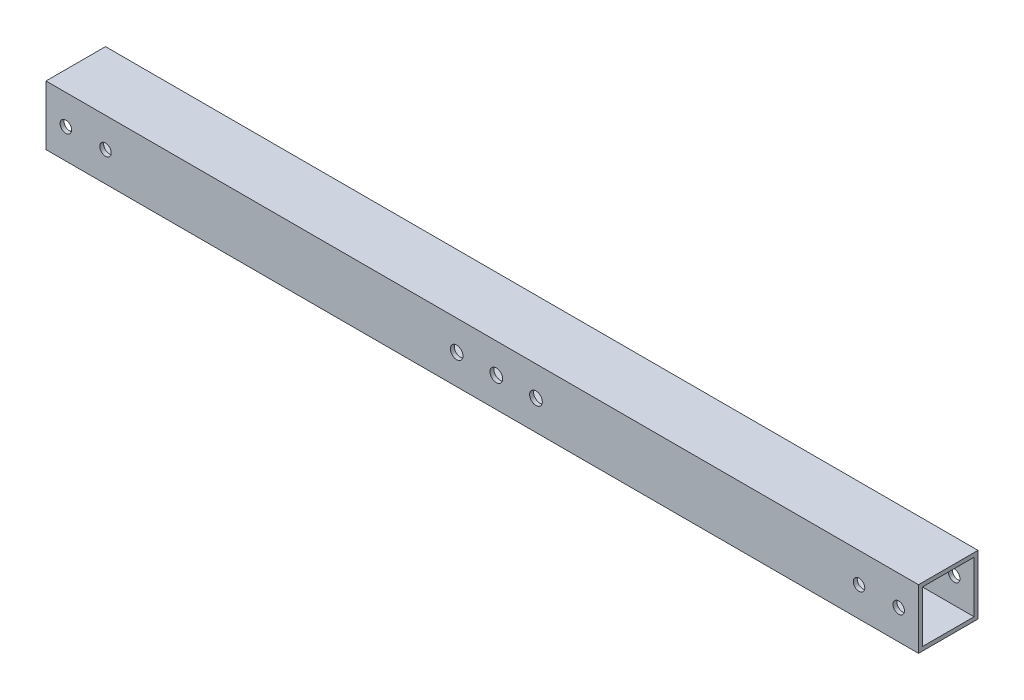
ISO-10303-21;
HEADER;
FILE_DESCRIPTION(('STEP AP214'),'2;1');
FILE_NAME('part.step','',(''),(''),'','','');
FILE_SCHEMA(('AUTOMOTIVE_DESIGN { 1 0 10303 214 1 1 1 1 }'));
ENDSEC;
DATA;
#1=APPLICATION_CONTEXT('core data for automotive mechanical design processes');
#2=APPLICATION_PROTOCOL_DEFINITION('international standard','automotive_design',2000,#1);
#3=PRODUCT_CONTEXT('',#1,'mechanical');
#4=PRODUCT('Part','Part','',(#3));
#5=PRODUCT_RELATED_PRODUCT_CATEGORY('part','',(#4));
#6=PRODUCT_DEFINITION_FORMATION('','',#4);
#7=PRODUCT_DEFINITION_CONTEXT('part definition',#1,'design');
#8=PRODUCT_DEFINITION('design','',#6,#7);
#9=PRODUCT_DEFINITION_SHAPE('','',#8);
#10=(LENGTH_UNIT() NAMED_UNIT(*) SI_UNIT(.MILLI.,.METRE.));
#11=(NAMED_UNIT(*) PLANE_ANGLE_UNIT() SI_UNIT($,.RADIAN.));
#12=(NAMED_UNIT(*) SI_UNIT($,.STERADIAN.) SOLID_ANGLE_UNIT());
#13=UNCERTAINTY_MEASURE_WITH_UNIT(LENGTH_MEASURE(1.E-05),#10,'distance_accuracy_value','');
#14=(GEOMETRIC_REPRESENTATION_CONTEXT(3) GLOBAL_UNCERTAINTY_ASSIGNED_CONTEXT((#13)) GLOBAL_UNIT_ASSIGNED_CONTEXT((#10,
#11,#12)) REPRESENTATION_CONTEXT('',''));
#15=CARTESIAN_POINT('',(0.,0.,0.));
#16=DIRECTION('',(0.,0.,1.));
#17=DIRECTION('',(1.,0.,0.));
#18=AXIS2_PLACEMENT_3D('',#15,#16,#17);
#19=CARTESIAN_POINT('',(220.,0.,0.));
#20=DIRECTION('',(-1.,0.,0.));
#21=DIRECTION('',(0.,0.,1.));
#22=AXIS2_PLACEMENT_3D('',#19,#20,#21);
#23=PLANE('',#22);
#24=DIRECTION('',(0.,1.,0.));
#25=VECTOR('',#24,1.);
#26=CARTESIAN_POINT('',(220.,-7.5,-7.5));
#27=LINE('',#26,#25);
#28=CARTESIAN_POINT('',(220.,-7.5,-7.5));
#29=VERTEX_POINT('',#28);
#30=CARTESIAN_POINT('',(220.,7.5,-7.5));
#31=VERTEX_POINT('',#30);
#32=EDGE_CURVE('E146',#29,#31,#27,.T.);
#33=ORIENTED_EDGE('',*,*,#32,.T.);
#34=DIRECTION('',(0.,0.,1.));
#35=VECTOR('',#34,1.);
#36=CARTESIAN_POINT('',(220.,7.5,7.5));
#37=LINE('',#36,#35);
#38=CARTESIAN_POINT('',(220.,7.5,7.5));
#39=VERTEX_POINT('',#38);
#40=EDGE_CURVE('E149',#31,#39,#37,.T.);
#41=ORIENTED_EDGE('',*,*,#40,.T.);
#42=DIRECTION('',(0.,-1.,0.));
#43=VECTOR('',#42,1.);
#44=CARTESIAN_POINT('',(220.,-7.5,7.5));
#45=LINE('',#44,#43);
#46=CARTESIAN_POINT('',(220.,-7.5,7.5));
#47=VERTEX_POINT('',#46);
#48=EDGE_CURVE('E152',#39,#47,#45,.T.);
#49=ORIENTED_EDGE('',*,*,#48,.T.);
#50=DIRECTION('',(0.,0.,-1.));
#51=VECTOR('',#50,1.);
#52=CARTESIAN_POINT('',(220.,-7.5,7.5));
#53=LINE('',#52,#51);
#54=EDGE_CURVE('E154',#47,#29,#53,.T.);
#55=ORIENTED_EDGE('',*,*,#54,.T.);
#56=EDGE_LOOP('',(#33,#41,#49,#55));
#57=FACE_BOUND('',#56,.T.);
#58=DIRECTION('',(0.,0.,-1.));
#59=VECTOR('',#58,1.);
#60=CARTESIAN_POINT('',(220.,-6.5,6.5));
#61=LINE('',#60,#59);
#62=CARTESIAN_POINT('',(220.,-6.5,6.5));
#63=VERTEX_POINT('',#62);
#64=CARTESIAN_POINT('',(220.,-6.5,-6.5));
#65=VERTEX_POINT('',#64);
#66=EDGE_CURVE('E108',#63,#65,#61,.T.);
#67=ORIENTED_EDGE('',*,*,#66,.F.);
#68=DIRECTION('',(0.,-1.,0.));
#69=VECTOR('',#68,1.);
#70=CARTESIAN_POINT('',(220.,-6.5,6.5));
#71=LINE('',#70,#69);
#72=CARTESIAN_POINT('',(220.,6.5,6.5));
#73=VERTEX_POINT('',#72);
#74=EDGE_CURVE('E130',#73,#63,#71,.T.);
#75=ORIENTED_EDGE('',*,*,#74,.F.);
#76=DIRECTION('',(0.,0.,1.));
#77=VECTOR('',#76,1.);
#78=CARTESIAN_POINT('',(220.,6.5,6.5));
#79=LINE('',#78,#77);
#80=CARTESIAN_POINT('',(220.,6.5,-6.5));
#81=VERTEX_POINT('',#80);
#82=EDGE_CURVE('E128',#81,#73,#79,.T.);
#83=ORIENTED_EDGE('',*,*,#82,.F.);
#84=DIRECTION('',(0.,1.,0.));
#85=VECTOR('',#84,1.);
#86=CARTESIAN_POINT('',(220.,-6.5,-6.5));
#87=LINE('',#86,#85);
#88=EDGE_CURVE('E116',#65,#81,#87,.T.);
#89=ORIENTED_EDGE('',*,*,#88,.F.);
#90=EDGE_LOOP('',(#67,#75,#83,#89));
#91=FACE_BOUND('',#90,.T.);
#92=ADVANCED_FACE('F41',(#57,#91),#23,.F.);
#93=CARTESIAN_POINT('',(0.,0.,0.));
#94=DIRECTION('',(-1.,0.,0.));
#95=DIRECTION('',(0.,0.,1.));
#96=AXIS2_PLACEMENT_3D('',#93,#94,#95);
#97=PLANE('',#96);
#98=DIRECTION('',(0.,1.,0.));
#99=VECTOR('',#98,1.);
#100=CARTESIAN_POINT('',(0.,-7.5,-7.5));
#101=LINE('',#100,#99);
#102=CARTESIAN_POINT('',(0.,-7.5,-7.5));
#103=VERTEX_POINT('',#102);
#104=CARTESIAN_POINT('',(0.,7.5,-7.5));
#105=VERTEX_POINT('',#104);
#106=EDGE_CURVE('E124',#103,#105,#101,.T.);
#107=ORIENTED_EDGE('',*,*,#106,.F.);
#108=DIRECTION('',(0.,0.,-1.));
#109=VECTOR('',#108,1.);
#110=CARTESIAN_POINT('',(0.,-7.5,7.5));
#111=LINE('',#110,#109);
#112=CARTESIAN_POINT('',(0.,-7.5,7.5));
#113=VERTEX_POINT('',#112);
#114=EDGE_CURVE('E150',#113,#103,#111,.T.);
#115=ORIENTED_EDGE('',*,*,#114,.F.);
#116=DIRECTION('',(0.,-1.,0.));
#117=VECTOR('',#116,1.);
#118=CARTESIAN_POINT('',(0.,-7.5,7.5));
#119=LINE('',#118,#117);
#120=CARTESIAN_POINT('',(0.,7.5,7.5));
#121=VERTEX_POINT('',#120);
#122=EDGE_CURVE('E161',#121,#113,#119,.T.);
#123=ORIENTED_EDGE('',*,*,#122,.F.);
#124=DIRECTION('',(0.,0.,1.));
#125=VECTOR('',#124,1.);
#126=CARTESIAN_POINT('',(0.,7.5,7.5));
#127=LINE('',#126,#125);
#128=EDGE_CURVE('E159',#105,#121,#127,.T.);
#129=ORIENTED_EDGE('',*,*,#128,.F.);
#130=EDGE_LOOP('',(#107,#115,#123,#129));
#131=FACE_BOUND('',#130,.T.);
#132=DIRECTION('',(0.,-1.,0.));
#133=VECTOR('',#132,1.);
#134=CARTESIAN_POINT('',(0.,-6.5,6.5));
#135=LINE('',#134,#133);
#136=CARTESIAN_POINT('',(0.,6.5,6.5));
#137=VERTEX_POINT('',#136);
#138=CARTESIAN_POINT('',(0.,-6.5,6.5));
#139=VERTEX_POINT('',#138);
#140=EDGE_CURVE('E117',#137,#139,#135,.T.);
#141=ORIENTED_EDGE('',*,*,#140,.T.);
#142=DIRECTION('',(0.,0.,-1.));
#143=VECTOR('',#142,1.);
#144=CARTESIAN_POINT('',(0.,-6.5,6.5));
#145=LINE('',#144,#143);
#146=CARTESIAN_POINT('',(0.,-6.5,-6.5));
#147=VERTEX_POINT('',#146);
#148=EDGE_CURVE('E66',#139,#147,#145,.T.);
#149=ORIENTED_EDGE('',*,*,#148,.T.);
#150=DIRECTION('',(0.,1.,0.));
#151=VECTOR('',#150,1.);
#152=CARTESIAN_POINT('',(0.,-6.5,-6.5));
#153=LINE('',#152,#151);
#154=CARTESIAN_POINT('',(0.,6.5,-6.5));
#155=VERTEX_POINT('',#154);
#156=EDGE_CURVE('E123',#147,#155,#153,.T.);
#157=ORIENTED_EDGE('',*,*,#156,.T.);
#158=DIRECTION('',(0.,0.,1.));
#159=VECTOR('',#158,1.);
#160=CARTESIAN_POINT('',(0.,6.5,6.5));
#161=LINE('',#160,#159);
#162=EDGE_CURVE('E138',#155,#137,#161,.T.);
#163=ORIENTED_EDGE('',*,*,#162,.T.);
#164=EDGE_LOOP('',(#141,#149,#157,#163));
#165=FACE_BOUND('',#164,.T.);
#166=ADVANCED_FACE('F231',(#131,#165),#97,.T.);
#167=CARTESIAN_POINT('',(220.,-7.5,-7.5));
#168=DIRECTION('',(0.,0.,1.));
#169=DIRECTION('',(1.,0.,0.));
#170=AXIS2_PLACEMENT_3D('',#167,#168,#169);
#171=PLANE('',#170);
#172=CARTESIAN_POINT('',(215.000000000001,-1.76247905159244E-12,-7.5));
#173=DIRECTION('',(0.,0.,1.));
#174=DIRECTION('',(1.,0.,0.));
#175=AXIS2_PLACEMENT_3D('',#172,#173,#174);
#176=CIRCLE('',#175,1.45000000000003);
#177=CARTESIAN_POINT('',(216.450000000001,-1.76247905159244E-12,-7.5));
#178=VERTEX_POINT('',#177);
#179=EDGE_CURVE('E175',#178,#178,#176,.T.);
#180=ORIENTED_EDGE('',*,*,#179,.T.);
#181=EDGE_LOOP('',(#180));
#182=FACE_BOUND('',#181,.T.);
#183=CARTESIAN_POINT('',(205.000000000001,-1.69309011255336E-12,-7.5));
#184=DIRECTION('',(0.,0.,1.));
#185=DIRECTION('',(1.,0.,0.));
#186=AXIS2_PLACEMENT_3D('',#183,#184,#185);
#187=CIRCLE('',#186,1.45);
#188=CARTESIAN_POINT('',(206.450000000001,-1.69309011255336E-12,-7.5));
#189=VERTEX_POINT('',#188);
#190=EDGE_CURVE('E285',#189,#189,#187,.T.);
#191=ORIENTED_EDGE('',*,*,#190,.T.);
#192=EDGE_LOOP('',(#191));
#193=FACE_BOUND('',#192,.T.);
#194=CARTESIAN_POINT('',(123.54518821599,-5.34294830600857E-12,-7.5));
#195=DIRECTION('',(0.,0.,1.));
#196=DIRECTION('',(1.,0.,0.));
#197=AXIS2_PLACEMENT_3D('',#194,#195,#196);
#198=CIRCLE('',#197,1.59999999999999);
#199=CARTESIAN_POINT('',(125.14518821599,-5.34294830600857E-12,-7.5));
#200=VERTEX_POINT('',#199);
#201=EDGE_CURVE('E289',#200,#200,#198,.T.);
#202=ORIENTED_EDGE('',*,*,#201,.T.);
#203=EDGE_LOOP('',(#202));
#204=FACE_BOUND('',#203,.T.);
#205=CARTESIAN_POINT('',(113.54518821599,-5.52335954751015E-12,-7.5));
#206=DIRECTION('',(0.,0.,1.));
#207=DIRECTION('',(1.,0.,0.));
#208=AXIS2_PLACEMENT_3D('',#205,#206,#207);
#209=CIRCLE('',#208,1.59999999999999);
#210=CARTESIAN_POINT('',(115.14518821599,-5.52335954751015E-12,-7.5));
#211=VERTEX_POINT('',#210);
#212=EDGE_CURVE('E293',#211,#211,#209,.T.);
#213=ORIENTED_EDGE('',*,*,#212,.T.);
#214=EDGE_LOOP('',(#213));
#215=FACE_BOUND('',#214,.T.);
#216=CARTESIAN_POINT('',(103.54518821599,-5.71764857681956E-12,-7.5));
#217=DIRECTION('',(0.,0.,1.));
#218=DIRECTION('',(1.,0.,0.));
#219=AXIS2_PLACEMENT_3D('',#216,#217,#218);
#220=CIRCLE('',#219,1.60000000000001);
#221=CARTESIAN_POINT('',(105.14518821599,-5.71764857681956E-12,-7.5));
#222=VERTEX_POINT('',#221);
#223=EDGE_CURVE('E297',#222,#222,#220,.T.);
#224=ORIENTED_EDGE('',*,*,#223,.T.);
#225=EDGE_LOOP('',(#224));
#226=FACE_BOUND('',#225,.T.);
#227=CARTESIAN_POINT('',(14.9999999999956,9.0205620750794E-13,-7.5));
#228=DIRECTION('',(0.,0.,1.));
#229=DIRECTION('',(1.,0.,0.));
#230=AXIS2_PLACEMENT_3D('',#227,#228,#229);
#231=CIRCLE('',#230,1.45);
#232=CARTESIAN_POINT('',(16.4499999999956,9.0205620750794E-13,-7.5));
#233=VERTEX_POINT('',#232);
#234=EDGE_CURVE('E301',#233,#233,#231,.T.);
#235=ORIENTED_EDGE('',*,*,#234,.T.);
#236=EDGE_LOOP('',(#235));
#237=FACE_BOUND('',#236,.T.);
#238=CARTESIAN_POINT('',(4.99999999999559,1.08246744900953E-12,-7.5));
#239=DIRECTION('',(0.,0.,1.));
#240=DIRECTION('',(1.,0.,0.));
#241=AXIS2_PLACEMENT_3D('',#238,#239,#240);
#242=CIRCLE('',#241,1.45);
#243=CARTESIAN_POINT('',(6.44999999999559,1.08246744900953E-12,-7.5));
#244=VERTEX_POINT('',#243);
#245=EDGE_CURVE('E304',#244,#244,#242,.T.);
#246=ORIENTED_EDGE('',*,*,#245,.T.);
#247=EDGE_LOOP('',(#246));
#248=FACE_BOUND('',#247,.T.);
#249=ORIENTED_EDGE('',*,*,#106,.T.);
#250=DIRECTION('',(-1.,0.,0.));
#251=VECTOR('',#250,1.);
#252=CARTESIAN_POINT('',(220.,7.5,-7.5));
#253=LINE('',#252,#251);
#254=EDGE_CURVE('E11',#31,#105,#253,.T.);
#255=ORIENTED_EDGE('',*,*,#254,.F.);
#256=ORIENTED_EDGE('',*,*,#32,.F.);
#257=DIRECTION('',(-1.,0.,0.));
#258=VECTOR('',#257,1.);
#259=CARTESIAN_POINT('',(220.,-7.5,-7.5));
#260=LINE('',#259,#258);
#261=EDGE_CURVE('E156',#29,#103,#260,.T.);
#262=ORIENTED_EDGE('',*,*,#261,.T.);
#263=EDGE_LOOP('',(#249,#255,#256,#262));
#264=FACE_BOUND('',#263,.T.);
#265=ADVANCED_FACE('F43',(#182,#193,#204,#215,#226,#237,#248,#264),#171,.F.);
#266=CARTESIAN_POINT('',(220.,7.5,7.5));
#267=DIRECTION('',(0.,-1.,0.));
#268=DIRECTION('',(0.,0.,-1.));
#269=AXIS2_PLACEMENT_3D('',#266,#267,#268);
#270=PLANE('',#269);
#271=ORIENTED_EDGE('',*,*,#128,.T.);
#272=DIRECTION('',(-1.,0.,0.));
#273=VECTOR('',#272,1.);
#274=CARTESIAN_POINT('',(220.,7.5,7.5));
#275=LINE('',#274,#273);
#276=EDGE_CURVE('E50',#39,#121,#275,.T.);
#277=ORIENTED_EDGE('',*,*,#276,.F.);
#278=ORIENTED_EDGE('',*,*,#40,.F.);
#279=ORIENTED_EDGE('',*,*,#254,.T.);
#280=EDGE_LOOP('',(#271,#277,#278,#279));
#281=FACE_BOUND('',#280,.T.);
#282=ADVANCED_FACE('F258',(#281),#270,.F.);
#283=CARTESIAN_POINT('',(220.,-7.5,7.5));
#284=DIRECTION('',(0.,0.,-1.));
#285=DIRECTION('',(-1.,0.,0.));
#286=AXIS2_PLACEMENT_3D('',#283,#284,#285);
#287=PLANE('',#286);
#288=CARTESIAN_POINT('',(215.000000000001,-1.76247905159244E-12,7.5));
#289=DIRECTION('',(0.,0.,1.));
#290=DIRECTION('',(1.,0.,0.));
#291=AXIS2_PLACEMENT_3D('',#288,#289,#290);
#292=CIRCLE('',#291,1.45000000000003);
#293=CARTESIAN_POINT('',(216.450000000001,-1.76247905159244E-12,7.5));
#294=VERTEX_POINT('',#293);
#295=EDGE_CURVE('E384',#294,#294,#292,.T.);
#296=ORIENTED_EDGE('',*,*,#295,.F.);
#297=EDGE_LOOP('',(#296));
#298=FACE_BOUND('',#297,.T.);
#299=CARTESIAN_POINT('',(205.000000000001,-1.69309011255336E-12,7.5));
#300=DIRECTION('',(0.,0.,1.));
#301=DIRECTION('',(1.,0.,0.));
#302=AXIS2_PLACEMENT_3D('',#299,#300,#301);
#303=CIRCLE('',#302,1.45);
#304=CARTESIAN_POINT('',(206.450000000001,-1.69309011255336E-12,7.5));
#305=VERTEX_POINT('',#304);
#306=EDGE_CURVE('E380',#305,#305,#303,.T.);
#307=ORIENTED_EDGE('',*,*,#306,.F.);
#308=EDGE_LOOP('',(#307));
#309=FACE_BOUND('',#308,.T.);
#310=CARTESIAN_POINT('',(123.54518821599,-5.34294830600857E-12,7.5));
#311=DIRECTION('',(0.,0.,1.));
#312=DIRECTION('',(1.,0.,0.));
#313=AXIS2_PLACEMENT_3D('',#310,#311,#312);
#314=CIRCLE('',#313,1.59999999999999);
#315=CARTESIAN_POINT('',(125.14518821599,-5.34294830600857E-12,7.5));
#316=VERTEX_POINT('',#315);
#317=EDGE_CURVE('E381',#316,#316,#314,.T.);
#318=ORIENTED_EDGE('',*,*,#317,.F.);
#319=EDGE_LOOP('',(#318));
#320=FACE_BOUND('',#319,.T.);
#321=CARTESIAN_POINT('',(113.54518821599,-5.52335954751015E-12,7.5));
#322=DIRECTION('',(0.,0.,1.));
#323=DIRECTION('',(1.,0.,0.));
#324=AXIS2_PLACEMENT_3D('',#321,#322,#323);
#325=CIRCLE('',#324,1.59999999999999);
#326=CARTESIAN_POINT('',(115.14518821599,-5.52335954751015E-12,7.5));
#327=VERTEX_POINT('',#326);
#328=EDGE_CURVE('E391',#327,#327,#325,.T.);
#329=ORIENTED_EDGE('',*,*,#328,.F.);
#330=EDGE_LOOP('',(#329));
#331=FACE_BOUND('',#330,.T.);
#332=CARTESIAN_POINT('',(103.54518821599,-5.71764857681956E-12,7.5));
#333=DIRECTION('',(0.,0.,1.));
#334=DIRECTION('',(1.,0.,0.));
#335=AXIS2_PLACEMENT_3D('',#332,#333,#334);
#336=CIRCLE('',#335,1.60000000000001);
#337=CARTESIAN_POINT('',(105.14518821599,-5.71764857681956E-12,7.5));
#338=VERTEX_POINT('',#337);
#339=EDGE_CURVE('E395',#338,#338,#336,.T.);
#340=ORIENTED_EDGE('',*,*,#339,.F.);
#341=EDGE_LOOP('',(#340));
#342=FACE_BOUND('',#341,.T.);
#343=CARTESIAN_POINT('',(14.9999999999956,9.0205620750794E-13,7.5));
#344=DIRECTION('',(0.,0.,1.));
#345=DIRECTION('',(1.,0.,0.));
#346=AXIS2_PLACEMENT_3D('',#343,#344,#345);
#347=CIRCLE('',#346,1.45);
#348=CARTESIAN_POINT('',(16.4499999999956,9.0205620750794E-13,7.5));
#349=VERTEX_POINT('',#348);
#350=EDGE_CURVE('E399',#349,#349,#347,.T.);
#351=ORIENTED_EDGE('',*,*,#350,.F.);
#352=EDGE_LOOP('',(#351));
#353=FACE_BOUND('',#352,.T.);
#354=CARTESIAN_POINT('',(4.99999999999559,1.08246744900953E-12,7.5));
#355=DIRECTION('',(0.,0.,1.));
#356=DIRECTION('',(1.,0.,0.));
#357=AXIS2_PLACEMENT_3D('',#354,#355,#356);
#358=CIRCLE('',#357,1.45);
#359=CARTESIAN_POINT('',(6.44999999999559,1.08246744900953E-12,7.5));
#360=VERTEX_POINT('',#359);
#361=EDGE_CURVE('E306',#360,#360,#358,.T.);
#362=ORIENTED_EDGE('',*,*,#361,.F.);
#363=EDGE_LOOP('',(#362));
#364=FACE_BOUND('',#363,.T.);
#365=ORIENTED_EDGE('',*,*,#122,.T.);
#366=DIRECTION('',(-1.,0.,0.));
#367=VECTOR('',#366,1.);
#368=CARTESIAN_POINT('',(220.,-7.5,7.5));
#369=LINE('',#368,#367);
#370=EDGE_CURVE('E166',#47,#113,#369,.T.);
#371=ORIENTED_EDGE('',*,*,#370,.F.);
#372=ORIENTED_EDGE('',*,*,#48,.F.);
#373=ORIENTED_EDGE('',*,*,#276,.T.);
#374=EDGE_LOOP('',(#365,#371,#372,#373));
#375=FACE_BOUND('',#374,.T.);
#376=ADVANCED_FACE('F255',(#298,#309,#320,#331,#342,#353,#364,#375),#287,.F.);
#377=CARTESIAN_POINT('',(220.,-7.5,7.5));
#378=DIRECTION('',(0.,1.,0.));
#379=DIRECTION('',(0.,0.,1.));
#380=AXIS2_PLACEMENT_3D('',#377,#378,#379);
#381=PLANE('',#380);
#382=ORIENTED_EDGE('',*,*,#114,.T.);
#383=ORIENTED_EDGE('',*,*,#261,.F.);
#384=ORIENTED_EDGE('',*,*,#54,.F.);
#385=ORIENTED_EDGE('',*,*,#370,.T.);
#386=EDGE_LOOP('',(#382,#383,#384,#385));
#387=FACE_BOUND('',#386,.T.);
#388=ADVANCED_FACE('F252',(#387),#381,.F.);
#389=CARTESIAN_POINT('',(220.,-6.5,6.5));
#390=DIRECTION('',(0.,1.,0.));
#391=DIRECTION('',(0.,0.,1.));
#392=AXIS2_PLACEMENT_3D('',#389,#390,#391);
#393=PLANE('',#392);
#394=ORIENTED_EDGE('',*,*,#148,.F.);
#395=DIRECTION('',(-1.,0.,0.));
#396=VECTOR('',#395,1.);
#397=CARTESIAN_POINT('',(220.,-6.5,6.5));
#398=LINE('',#397,#396);
#399=EDGE_CURVE('E112',#63,#139,#398,.T.);
#400=ORIENTED_EDGE('',*,*,#399,.F.);
#401=ORIENTED_EDGE('',*,*,#66,.T.);
#402=DIRECTION('',(-1.,0.,0.));
#403=VECTOR('',#402,1.);
#404=CARTESIAN_POINT('',(220.,-6.5,-6.5));
#405=LINE('',#404,#403);
#406=EDGE_CURVE('E111',#65,#147,#405,.T.);
#407=ORIENTED_EDGE('',*,*,#406,.T.);
#408=EDGE_LOOP('',(#394,#400,#401,#407));
#409=FACE_BOUND('',#408,.T.);
#410=ADVANCED_FACE('F110',(#409),#393,.T.);
#411=CARTESIAN_POINT('',(220.,-6.5,-6.5));
#412=DIRECTION('',(0.,0.,1.));
#413=DIRECTION('',(0.,-1.,0.));
#414=AXIS2_PLACEMENT_3D('',#411,#412,#413);
#415=PLANE('',#414);
#416=CARTESIAN_POINT('',(215.000000000001,-1.76247905159244E-12,-6.5));
#417=DIRECTION('',(0.,0.,1.));
#418=DIRECTION('',(0.,-1.,0.));
#419=AXIS2_PLACEMENT_3D('',#416,#417,#418);
#420=CIRCLE('',#419,1.45000000000003);
#421=CARTESIAN_POINT('',(215.000000000001,-1.45000000000179,-6.5));
#422=VERTEX_POINT('',#421);
#423=EDGE_CURVE('E136',#422,#422,#420,.T.);
#424=ORIENTED_EDGE('',*,*,#423,.F.);
#425=EDGE_LOOP('',(#424));
#426=FACE_BOUND('',#425,.T.);
#427=CARTESIAN_POINT('',(205.000000000001,-1.69309011255336E-12,-6.5));
#428=DIRECTION('',(0.,0.,1.));
#429=DIRECTION('',(0.,-1.,0.));
#430=AXIS2_PLACEMENT_3D('',#427,#428,#429);
#431=CIRCLE('',#430,1.45);
#432=CARTESIAN_POINT('',(205.000000000001,-1.45000000000169,-6.5));
#433=VERTEX_POINT('',#432);
#434=EDGE_CURVE('E193',#433,#433,#431,.T.);
#435=ORIENTED_EDGE('',*,*,#434,.F.);
#436=EDGE_LOOP('',(#435));
#437=FACE_BOUND('',#436,.T.);
#438=CARTESIAN_POINT('',(123.54518821599,-5.34294830600857E-12,-6.5));
#439=DIRECTION('',(0.,0.,1.));
#440=DIRECTION('',(0.,-1.,0.));
#441=AXIS2_PLACEMENT_3D('',#438,#439,#440);
#442=CIRCLE('',#441,1.59999999999999);
#443=CARTESIAN_POINT('',(123.54518821599,-1.60000000000533,-6.5));
#444=VERTEX_POINT('',#443);
#445=EDGE_CURVE('E190',#444,#444,#442,.T.);
#446=ORIENTED_EDGE('',*,*,#445,.F.);
#447=EDGE_LOOP('',(#446));
#448=FACE_BOUND('',#447,.T.);
#449=CARTESIAN_POINT('',(113.54518821599,-5.52335954751015E-12,-6.5));
#450=DIRECTION('',(0.,0.,1.));
#451=DIRECTION('',(0.,-1.,0.));
#452=AXIS2_PLACEMENT_3D('',#449,#450,#451);
#453=CIRCLE('',#452,1.59999999999999);
#454=CARTESIAN_POINT('',(113.54518821599,-1.60000000000551,-6.5));
#455=VERTEX_POINT('',#454);
#456=EDGE_CURVE('E187',#455,#455,#453,.T.);
#457=ORIENTED_EDGE('',*,*,#456,.F.);
#458=EDGE_LOOP('',(#457));
#459=FACE_BOUND('',#458,.T.);
#460=CARTESIAN_POINT('',(103.54518821599,-5.71764857681956E-12,-6.5));
#461=DIRECTION('',(0.,0.,1.));
#462=DIRECTION('',(0.,-1.,0.));
#463=AXIS2_PLACEMENT_3D('',#460,#461,#462);
#464=CIRCLE('',#463,1.60000000000001);
#465=CARTESIAN_POINT('',(103.54518821599,-1.60000000000572,-6.5));
#466=VERTEX_POINT('',#465);
#467=EDGE_CURVE('E183',#466,#466,#464,.T.);
#468=ORIENTED_EDGE('',*,*,#467,.F.);
#469=EDGE_LOOP('',(#468));
#470=FACE_BOUND('',#469,.T.);
#471=CARTESIAN_POINT('',(14.9999999999956,9.0205620750794E-13,-6.5));
#472=DIRECTION('',(0.,0.,1.));
#473=DIRECTION('',(0.,-1.,0.));
#474=AXIS2_PLACEMENT_3D('',#471,#472,#473);
#475=CIRCLE('',#474,1.45);
#476=CARTESIAN_POINT('',(14.9999999999956,-1.4499999999991,-6.5));
#477=VERTEX_POINT('',#476);
#478=EDGE_CURVE('E179',#477,#477,#475,.T.);
#479=ORIENTED_EDGE('',*,*,#478,.F.);
#480=EDGE_LOOP('',(#479));
#481=FACE_BOUND('',#480,.T.);
#482=CARTESIAN_POINT('',(4.99999999999559,1.08246744900953E-12,-6.5));
#483=DIRECTION('',(0.,0.,1.));
#484=DIRECTION('',(0.,-1.,0.));
#485=AXIS2_PLACEMENT_3D('',#482,#483,#484);
#486=CIRCLE('',#485,1.45);
#487=CARTESIAN_POINT('',(4.99999999999559,-1.44999999999892,-6.5));
#488=VERTEX_POINT('',#487);
#489=EDGE_CURVE('E174',#488,#488,#486,.T.);
#490=ORIENTED_EDGE('',*,*,#489,.F.);
#491=EDGE_LOOP('',(#490));
#492=FACE_BOUND('',#491,.T.);
#493=ORIENTED_EDGE('',*,*,#156,.F.);
#494=ORIENTED_EDGE('',*,*,#406,.F.);
#495=ORIENTED_EDGE('',*,*,#88,.T.);
#496=DIRECTION('',(-1.,0.,0.));
#497=VECTOR('',#496,1.);
#498=CARTESIAN_POINT('',(220.,6.5,-6.5));
#499=LINE('',#498,#497);
#500=EDGE_CURVE('E125',#81,#155,#499,.T.);
#501=ORIENTED_EDGE('',*,*,#500,.T.);
#502=EDGE_LOOP('',(#493,#494,#495,#501));
#503=FACE_BOUND('',#502,.T.);
#504=ADVANCED_FACE('F120',(#426,#437,#448,#459,#470,#481,#492,#503),#415,.T.);
#505=CARTESIAN_POINT('',(220.,6.5,6.5));
#506=DIRECTION('',(0.,-1.,0.));
#507=DIRECTION('',(0.,0.,-1.));
#508=AXIS2_PLACEMENT_3D('',#505,#506,#507);
#509=PLANE('',#508);
#510=ORIENTED_EDGE('',*,*,#162,.F.);
#511=ORIENTED_EDGE('',*,*,#500,.F.);
#512=ORIENTED_EDGE('',*,*,#82,.T.);
#513=DIRECTION('',(-1.,0.,0.));
#514=VECTOR('',#513,1.);
#515=CARTESIAN_POINT('',(220.,6.5,6.5));
#516=LINE('',#515,#514);
#517=EDGE_CURVE('E58',#73,#137,#516,.T.);
#518=ORIENTED_EDGE('',*,*,#517,.T.);
#519=EDGE_LOOP('',(#510,#511,#512,#518));
#520=FACE_BOUND('',#519,.T.);
#521=ADVANCED_FACE('F217',(#520),#509,.T.);
#522=CARTESIAN_POINT('',(220.,-6.5,6.5));
#523=DIRECTION('',(0.,0.,-1.));
#524=DIRECTION('',(-1.,0.,0.));
#525=AXIS2_PLACEMENT_3D('',#522,#523,#524);
#526=PLANE('',#525);
#527=CARTESIAN_POINT('',(215.000000000001,-1.76247905159244E-12,6.5));
#528=DIRECTION('',(0.,0.,-1.));
#529=DIRECTION('',(-1.,0.,0.));
#530=AXIS2_PLACEMENT_3D('',#527,#528,#529);
#531=CIRCLE('',#530,1.45000000000003);
#532=CARTESIAN_POINT('',(213.550000000001,-1.76247905159244E-12,6.5));
#533=VERTEX_POINT('',#532);
#534=EDGE_CURVE('E45',#533,#533,#531,.T.);
#535=ORIENTED_EDGE('',*,*,#534,.F.);
#536=EDGE_LOOP('',(#535));
#537=FACE_BOUND('',#536,.T.);
#538=CARTESIAN_POINT('',(205.000000000001,-1.69309011255336E-12,6.5));
#539=DIRECTION('',(0.,0.,-1.));
#540=DIRECTION('',(-1.,0.,0.));
#541=AXIS2_PLACEMENT_3D('',#538,#539,#540);
#542=CIRCLE('',#541,1.45);
#543=CARTESIAN_POINT('',(203.550000000001,-1.69309011255336E-12,6.5));
#544=VERTEX_POINT('',#543);
#545=EDGE_CURVE('E191',#544,#544,#542,.T.);
#546=ORIENTED_EDGE('',*,*,#545,.F.);
#547=EDGE_LOOP('',(#546));
#548=FACE_BOUND('',#547,.T.);
#549=CARTESIAN_POINT('',(123.54518821599,-5.34294830600857E-12,6.5));
#550=DIRECTION('',(0.,0.,-1.));
#551=DIRECTION('',(-1.,0.,0.));
#552=AXIS2_PLACEMENT_3D('',#549,#550,#551);
#553=CIRCLE('',#552,1.59999999999999);
#554=CARTESIAN_POINT('',(121.94518821599,-5.34294830600857E-12,6.5));
#555=VERTEX_POINT('',#554);
#556=EDGE_CURVE('E188',#555,#555,#553,.T.);
#557=ORIENTED_EDGE('',*,*,#556,.F.);
#558=EDGE_LOOP('',(#557));
#559=FACE_BOUND('',#558,.T.);
#560=CARTESIAN_POINT('',(113.54518821599,-5.52335954751015E-12,6.5));
#561=DIRECTION('',(0.,0.,-1.));
#562=DIRECTION('',(-1.,0.,0.));
#563=AXIS2_PLACEMENT_3D('',#560,#561,#562);
#564=CIRCLE('',#563,1.59999999999999);
#565=CARTESIAN_POINT('',(111.94518821599,-5.52335954751015E-12,6.5));
#566=VERTEX_POINT('',#565);
#567=EDGE_CURVE('E184',#566,#566,#564,.T.);
#568=ORIENTED_EDGE('',*,*,#567,.F.);
#569=EDGE_LOOP('',(#568));
#570=FACE_BOUND('',#569,.T.);
#571=CARTESIAN_POINT('',(103.54518821599,-5.71764857681956E-12,6.5));
#572=DIRECTION('',(0.,0.,-1.));
#573=DIRECTION('',(-1.,0.,0.));
#574=AXIS2_PLACEMENT_3D('',#571,#572,#573);
#575=CIRCLE('',#574,1.60000000000001);
#576=CARTESIAN_POINT('',(101.94518821599,-5.71764857681956E-12,6.5));
#577=VERTEX_POINT('',#576);
#578=EDGE_CURVE('E180',#577,#577,#575,.T.);
#579=ORIENTED_EDGE('',*,*,#578,.F.);
#580=EDGE_LOOP('',(#579));
#581=FACE_BOUND('',#580,.T.);
#582=CARTESIAN_POINT('',(14.9999999999956,9.0205620750794E-13,6.5));
#583=DIRECTION('',(0.,0.,-1.));
#584=DIRECTION('',(-1.,0.,0.));
#585=AXIS2_PLACEMENT_3D('',#582,#583,#584);
#586=CIRCLE('',#585,1.45);
#587=CARTESIAN_POINT('',(13.5499999999956,9.0205620750794E-13,6.5));
#588=VERTEX_POINT('',#587);
#589=EDGE_CURVE('E176',#588,#588,#586,.T.);
#590=ORIENTED_EDGE('',*,*,#589,.F.);
#591=EDGE_LOOP('',(#590));
#592=FACE_BOUND('',#591,.T.);
#593=CARTESIAN_POINT('',(4.99999999999559,1.08246744900953E-12,6.5));
#594=DIRECTION('',(0.,0.,-1.));
#595=DIRECTION('',(-1.,0.,0.));
#596=AXIS2_PLACEMENT_3D('',#593,#594,#595);
#597=CIRCLE('',#596,1.45);
#598=CARTESIAN_POINT('',(3.54999999999559,1.08246744900953E-12,6.5));
#599=VERTEX_POINT('',#598);
#600=EDGE_CURVE('E171',#599,#599,#597,.T.);
#601=ORIENTED_EDGE('',*,*,#600,.F.);
#602=EDGE_LOOP('',(#601));
#603=FACE_BOUND('',#602,.T.);
#604=ORIENTED_EDGE('',*,*,#140,.F.);
#605=ORIENTED_EDGE('',*,*,#517,.F.);
#606=ORIENTED_EDGE('',*,*,#74,.T.);
#607=ORIENTED_EDGE('',*,*,#399,.T.);
#608=EDGE_LOOP('',(#604,#605,#606,#607));
#609=FACE_BOUND('',#608,.T.);
#610=ADVANCED_FACE('F213',(#537,#548,#559,#570,#581,#592,#603,#609),#526,.T.);
#611=CARTESIAN_POINT('',(4.99999999999559,1.08246744900953E-12,-7.5));
#612=DIRECTION('',(0.,0.,1.));
#613=DIRECTION('',(1.,0.,0.));
#614=AXIS2_PLACEMENT_3D('',#611,#612,#613);
#615=CYLINDRICAL_SURFACE('',#614,1.45);
#616=ORIENTED_EDGE('',*,*,#600,.T.);
#617=EDGE_LOOP('',(#616));
#618=FACE_BOUND('',#617,.T.);
#619=ORIENTED_EDGE('',*,*,#361,.T.);
#620=EDGE_LOOP('',(#619));
#621=FACE_BOUND('',#620,.T.);
#622=ADVANCED_FACE('F216',(#618,#621),#615,.F.);
#623=CARTESIAN_POINT('',(14.9999999999956,9.0205620750794E-13,-7.5));
#624=DIRECTION('',(0.,0.,1.));
#625=DIRECTION('',(1.,0.,0.));
#626=AXIS2_PLACEMENT_3D('',#623,#624,#625);
#627=CYLINDRICAL_SURFACE('',#626,1.45);
#628=ORIENTED_EDGE('',*,*,#589,.T.);
#629=EDGE_LOOP('',(#628));
#630=FACE_BOUND('',#629,.T.);
#631=ORIENTED_EDGE('',*,*,#350,.T.);
#632=EDGE_LOOP('',(#631));
#633=FACE_BOUND('',#632,.T.);
#634=ADVANCED_FACE('F336',(#630,#633),#627,.F.);
#635=CARTESIAN_POINT('',(103.54518821599,-5.71764857681956E-12,-7.5));
#636=DIRECTION('',(0.,0.,1.));
#637=DIRECTION('',(1.,0.,0.));
#638=AXIS2_PLACEMENT_3D('',#635,#636,#637);
#639=CYLINDRICAL_SURFACE('',#638,1.60000000000001);
#640=ORIENTED_EDGE('',*,*,#578,.T.);
#641=EDGE_LOOP('',(#640));
#642=FACE_BOUND('',#641,.T.);
#643=ORIENTED_EDGE('',*,*,#339,.T.);
#644=EDGE_LOOP('',(#643));
#645=FACE_BOUND('',#644,.T.);
#646=ADVANCED_FACE('F345',(#642,#645),#639,.F.);
#647=CARTESIAN_POINT('',(113.54518821599,-5.52335954751015E-12,-7.5));
#648=DIRECTION('',(0.,0.,1.));
#649=DIRECTION('',(1.,0.,0.));
#650=AXIS2_PLACEMENT_3D('',#647,#648,#649);
#651=CYLINDRICAL_SURFACE('',#650,1.59999999999999);
#652=ORIENTED_EDGE('',*,*,#567,.T.);
#653=EDGE_LOOP('',(#652));
#654=FACE_BOUND('',#653,.T.);
#655=ORIENTED_EDGE('',*,*,#328,.T.);
#656=EDGE_LOOP('',(#655));
#657=FACE_BOUND('',#656,.T.);
#658=ADVANCED_FACE('F353',(#654,#657),#651,.F.);
#659=CARTESIAN_POINT('',(123.54518821599,-5.34294830600857E-12,-7.5));
#660=DIRECTION('',(0.,0.,1.));
#661=DIRECTION('',(1.,0.,0.));
#662=AXIS2_PLACEMENT_3D('',#659,#660,#661);
#663=CYLINDRICAL_SURFACE('',#662,1.59999999999999);
#664=ORIENTED_EDGE('',*,*,#556,.T.);
#665=EDGE_LOOP('',(#664));
#666=FACE_BOUND('',#665,.T.);
#667=ORIENTED_EDGE('',*,*,#317,.T.);
#668=EDGE_LOOP('',(#667));
#669=FACE_BOUND('',#668,.T.);
#670=ADVANCED_FACE('F360',(#666,#669),#663,.F.);
#671=CARTESIAN_POINT('',(205.000000000001,-1.69309011255336E-12,-7.5));
#672=DIRECTION('',(0.,0.,1.));
#673=DIRECTION('',(1.,0.,0.));
#674=AXIS2_PLACEMENT_3D('',#671,#672,#673);
#675=CYLINDRICAL_SURFACE('',#674,1.45);
#676=ORIENTED_EDGE('',*,*,#545,.T.);
#677=EDGE_LOOP('',(#676));
#678=FACE_BOUND('',#677,.T.);
#679=ORIENTED_EDGE('',*,*,#306,.T.);
#680=EDGE_LOOP('',(#679));
#681=FACE_BOUND('',#680,.T.);
#682=ADVANCED_FACE('F337',(#678,#681),#675,.F.);
#683=CARTESIAN_POINT('',(215.000000000001,-1.76247905159244E-12,-7.5));
#684=DIRECTION('',(0.,0.,1.));
#685=DIRECTION('',(1.,0.,0.));
#686=AXIS2_PLACEMENT_3D('',#683,#684,#685);
#687=CYLINDRICAL_SURFACE('',#686,1.45000000000003);
#688=ORIENTED_EDGE('',*,*,#534,.T.);
#689=EDGE_LOOP('',(#688));
#690=FACE_BOUND('',#689,.T.);
#691=ORIENTED_EDGE('',*,*,#295,.T.);
#692=EDGE_LOOP('',(#691));
#693=FACE_BOUND('',#692,.T.);
#694=ADVANCED_FACE('F210',(#690,#693),#687,.F.);
#695=ORIENTED_EDGE('',*,*,#489,.T.);
#696=EDGE_LOOP('',(#695));
#697=FACE_BOUND('',#696,.T.);
#698=ORIENTED_EDGE('',*,*,#245,.F.);
#699=EDGE_LOOP('',(#698));
#700=FACE_BOUND('',#699,.T.);
#701=ADVANCED_FACE('F326',(#697,#700),#615,.F.);
#702=ORIENTED_EDGE('',*,*,#478,.T.);
#703=EDGE_LOOP('',(#702));
#704=FACE_BOUND('',#703,.T.);
#705=ORIENTED_EDGE('',*,*,#234,.F.);
#706=EDGE_LOOP('',(#705));
#707=FACE_BOUND('',#706,.T.);
#708=ADVANCED_FACE('F328',(#704,#707),#627,.F.);
#709=ORIENTED_EDGE('',*,*,#467,.T.);
#710=EDGE_LOOP('',(#709));
#711=FACE_BOUND('',#710,.T.);
#712=ORIENTED_EDGE('',*,*,#223,.F.);
#713=EDGE_LOOP('',(#712));
#714=FACE_BOUND('',#713,.T.);
#715=ADVANCED_FACE('F318',(#711,#714),#639,.F.);
#716=ORIENTED_EDGE('',*,*,#456,.T.);
#717=EDGE_LOOP('',(#716));
#718=FACE_BOUND('',#717,.T.);
#719=ORIENTED_EDGE('',*,*,#212,.F.);
#720=EDGE_LOOP('',(#719));
#721=FACE_BOUND('',#720,.T.);
#722=ADVANCED_FACE('F362',(#718,#721),#651,.F.);
#723=ORIENTED_EDGE('',*,*,#445,.T.);
#724=EDGE_LOOP('',(#723));
#725=FACE_BOUND('',#724,.T.);
#726=ORIENTED_EDGE('',*,*,#201,.F.);
#727=EDGE_LOOP('',(#726));
#728=FACE_BOUND('',#727,.T.);
#729=ADVANCED_FACE('F366',(#725,#728),#663,.F.);
#730=ORIENTED_EDGE('',*,*,#434,.T.);
#731=EDGE_LOOP('',(#730));
#732=FACE_BOUND('',#731,.T.);
#733=ORIENTED_EDGE('',*,*,#190,.F.);
#734=EDGE_LOOP('',(#733));
#735=FACE_BOUND('',#734,.T.);
#736=ADVANCED_FACE('F368',(#732,#735),#675,.F.);
#737=ORIENTED_EDGE('',*,*,#423,.T.);
#738=EDGE_LOOP('',(#737));
#739=FACE_BOUND('',#738,.T.);
#740=ORIENTED_EDGE('',*,*,#179,.F.);
#741=EDGE_LOOP('',(#740));
#742=FACE_BOUND('',#741,.T.);
#743=ADVANCED_FACE('F339',(#739,#742),#687,.F.);
#744=CLOSED_SHELL('',(#92,#166,#265,#282,#376,#388,#410,#504,#521,#610,#622,#634,#646,#658,#670,
#682,#694,#701,#708,#715,#722,#729,#736,#743));
#745=MANIFOLD_SOLID_BREP('B2',#744);
#746=ADVANCED_BREP_SHAPE_REPRESENTATION('',(#18,#745),#14);
#747=SHAPE_DEFINITION_REPRESENTATION(#9,#746);
ENDSEC;
END-ISO-10303-21;
